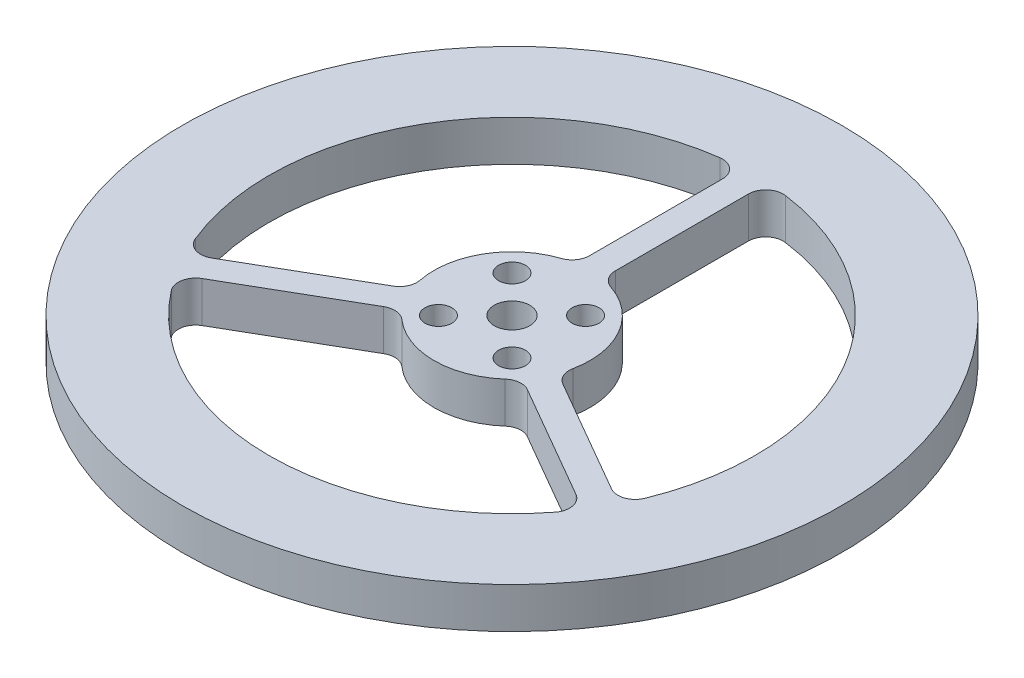
ISO-10303-21;
HEADER;
FILE_DESCRIPTION(('STEP AP214'),'2;1');
FILE_NAME('part.step','',(''),(''),'','','');
FILE_SCHEMA(('AUTOMOTIVE_DESIGN { 1 0 10303 214 1 1 1 1 }'));
ENDSEC;
DATA;
#1=APPLICATION_CONTEXT('core data for automotive mechanical design processes');
#2=APPLICATION_PROTOCOL_DEFINITION('international standard','automotive_design',2000,#1);
#3=PRODUCT_CONTEXT('',#1,'mechanical');
#4=PRODUCT('Part','Part','',(#3));
#5=PRODUCT_RELATED_PRODUCT_CATEGORY('part','',(#4));
#6=PRODUCT_DEFINITION_FORMATION('','',#4);
#7=PRODUCT_DEFINITION_CONTEXT('part definition',#1,'design');
#8=PRODUCT_DEFINITION('design','',#6,#7);
#9=PRODUCT_DEFINITION_SHAPE('','',#8);
#10=(LENGTH_UNIT() NAMED_UNIT(*) SI_UNIT(.MILLI.,.METRE.));
#11=(NAMED_UNIT(*) PLANE_ANGLE_UNIT() SI_UNIT($,.RADIAN.));
#12=(NAMED_UNIT(*) SI_UNIT($,.STERADIAN.) SOLID_ANGLE_UNIT());
#13=UNCERTAINTY_MEASURE_WITH_UNIT(LENGTH_MEASURE(1.E-05),#10,'distance_accuracy_value','');
#14=(GEOMETRIC_REPRESENTATION_CONTEXT(3) GLOBAL_UNCERTAINTY_ASSIGNED_CONTEXT((#13)) GLOBAL_UNIT_ASSIGNED_CONTEXT((#10,
#11,#12)) REPRESENTATION_CONTEXT('',''));
#15=CARTESIAN_POINT('',(0.,0.,0.));
#16=DIRECTION('',(0.,0.,1.));
#17=DIRECTION('',(1.,0.,0.));
#18=AXIS2_PLACEMENT_3D('',#15,#16,#17);
#19=CARTESIAN_POINT('',(0.,4.7,0.));
#20=DIRECTION('',(0.,-1.,0.));
#21=DIRECTION('',(0.,0.,-1.));
#22=AXIS2_PLACEMENT_3D('',#19,#20,#21);
#23=CYLINDRICAL_SURFACE('',#22,28.);
#24=CARTESIAN_POINT('',(0.,4.7,0.));
#25=DIRECTION('',(0.,1.,0.));
#26=DIRECTION('',(0.,0.,1.));
#27=AXIS2_PLACEMENT_3D('',#24,#25,#26);
#28=CIRCLE('',#27,28.);
#29=CARTESIAN_POINT('',(-22.1433823379621,4.7,17.1368205520986));
#30=VERTEX_POINT('',#29);
#31=CARTESIAN_POINT('',(22.143382337963,4.7,17.1368205520975));
#32=VERTEX_POINT('',#31);
#33=EDGE_CURVE('E450',#30,#32,#28,.T.);
#34=ORIENTED_EDGE('',*,*,#33,.T.);
#35=DIRECTION('',(0.,-1.,0.));
#36=VECTOR('',#35,1.);
#37=CARTESIAN_POINT('',(22.143382337963,4.7,17.1368205520975));
#38=LINE('',#37,#36);
#39=CARTESIAN_POINT('',(22.143382337963,0.,17.1368205520975));
#40=VERTEX_POINT('',#39);
#41=EDGE_CURVE('E251',#32,#40,#38,.T.);
#42=ORIENTED_EDGE('',*,*,#41,.T.);
#43=CARTESIAN_POINT('',(0.,0.,0.));
#44=DIRECTION('',(0.,1.,0.));
#45=DIRECTION('',(0.,0.,1.));
#46=AXIS2_PLACEMENT_3D('',#43,#44,#45);
#47=CIRCLE('',#46,28.);
#48=CARTESIAN_POINT('',(-22.1433823379621,0.,17.1368205520986));
#49=VERTEX_POINT('',#48);
#50=EDGE_CURVE('E232',#49,#40,#47,.T.);
#51=ORIENTED_EDGE('',*,*,#50,.F.);
#52=DIRECTION('',(0.,-1.,0.));
#53=VECTOR('',#52,1.);
#54=CARTESIAN_POINT('',(-22.1433823379621,4.7,17.1368205520986));
#55=LINE('',#54,#53);
#56=EDGE_CURVE('E242',#49,#30,#55,.F.);
#57=ORIENTED_EDGE('',*,*,#56,.T.);
#58=EDGE_LOOP('',(#34,#42,#51,#57));
#59=FACE_BOUND('',#58,.T.);
#60=ADVANCED_FACE('F44',(#59),#23,.F.);
#61=CARTESIAN_POINT('',(-3.76923076923076,0.,-27.7451419064362));
#62=VERTEX_POINT('',#61);
#63=CARTESIAN_POINT('',(-25.9126131071931,0.,10.6083213543391));
#64=VERTEX_POINT('',#63);
#65=EDGE_CURVE('E235',#62,#64,#47,.T.);
#66=ORIENTED_EDGE('',*,*,#65,.F.);
#67=DIRECTION('',(0.,-1.,0.));
#68=VECTOR('',#67,1.);
#69=CARTESIAN_POINT('',(-3.76923076923076,4.7,-27.7451419064362));
#70=LINE('',#69,#68);
#71=CARTESIAN_POINT('',(-3.76923076923076,4.7,-27.7451419064362));
#72=VERTEX_POINT('',#71);
#73=EDGE_CURVE('E267',#62,#72,#70,.F.);
#74=ORIENTED_EDGE('',*,*,#73,.T.);
#75=CARTESIAN_POINT('',(-25.9126131071931,4.7,10.6083213543391));
#76=VERTEX_POINT('',#75);
#77=EDGE_CURVE('E446',#72,#76,#28,.T.);
#78=ORIENTED_EDGE('',*,*,#77,.T.);
#79=DIRECTION('',(0.,-1.,0.));
#80=VECTOR('',#79,1.);
#81=CARTESIAN_POINT('',(-25.9126131071931,4.7,10.6083213543391));
#82=LINE('',#81,#80);
#83=EDGE_CURVE('E263',#76,#64,#82,.T.);
#84=ORIENTED_EDGE('',*,*,#83,.T.);
#85=EDGE_LOOP('',(#66,#74,#78,#84));
#86=FACE_BOUND('',#85,.T.);
#87=ADVANCED_FACE('F544',(#86),#23,.F.);
#88=CARTESIAN_POINT('',(0.,30.1558441227157,0.));
#89=DIRECTION('',(0.,-1.,0.));
#90=DIRECTION('',(0.,0.,-1.));
#91=AXIS2_PLACEMENT_3D('',#88,#89,#90);
#92=CYLINDRICAL_SURFACE('',#91,9.);
#93=CARTESIAN_POINT('',(0.,0.,0.));
#94=DIRECTION('',(0.,1.,0.));
#95=DIRECTION('',(0.,0.,1.));
#96=AXIS2_PLACEMENT_3D('',#93,#94,#95);
#97=CIRCLE('',#96,9.);
#98=CARTESIAN_POINT('',(-5.95734212789478,0.,6.74611553200878));
#99=VERTEX_POINT('',#98);
#100=CARTESIAN_POINT('',(5.95734212789561,0.,6.74611553200804));
#101=VERTEX_POINT('',#100);
#102=EDGE_CURVE('E410',#99,#101,#97,.T.);
#103=ORIENTED_EDGE('',*,*,#102,.T.);
#104=DIRECTION('',(0.,-1.,0.));
#105=VECTOR('',#104,1.);
#106=CARTESIAN_POINT('',(5.95734212789561,30.1558441227157,6.74611553200804));
#107=LINE('',#106,#105);
#108=CARTESIAN_POINT('',(5.95734212789561,4.7,6.74611553200804));
#109=VERTEX_POINT('',#108);
#110=EDGE_CURVE('E350',#101,#109,#107,.F.);
#111=ORIENTED_EDGE('',*,*,#110,.T.);
#112=CARTESIAN_POINT('',(0.,4.7,0.));
#113=DIRECTION('',(0.,1.,0.));
#114=DIRECTION('',(0.,0.,1.));
#115=AXIS2_PLACEMENT_3D('',#112,#113,#114);
#116=CIRCLE('',#115,9.);
#117=CARTESIAN_POINT('',(-5.95734212789478,4.7,6.74611553200878));
#118=VERTEX_POINT('',#117);
#119=EDGE_CURVE('E394',#118,#109,#116,.T.);
#120=ORIENTED_EDGE('',*,*,#119,.F.);
#121=DIRECTION('',(0.,-1.,0.));
#122=VECTOR('',#121,1.);
#123=CARTESIAN_POINT('',(-5.95734212789478,30.1558441227157,6.74611553200878));
#124=LINE('',#123,#122);
#125=EDGE_CURVE('E346',#118,#99,#124,.T.);
#126=ORIENTED_EDGE('',*,*,#125,.T.);
#127=EDGE_LOOP('',(#103,#111,#120,#126));
#128=FACE_BOUND('',#127,.T.);
#129=ADVANCED_FACE('F413',(#128),#92,.T.);
#130=CARTESIAN_POINT('',(-2.86363636363636,4.7,-8.53226738779672));
#131=VERTEX_POINT('',#130);
#132=CARTESIAN_POINT('',(-8.82097849153151,4.7,1.78615185578902));
#133=VERTEX_POINT('',#132);
#134=EDGE_CURVE('E440',#131,#133,#116,.T.);
#135=ORIENTED_EDGE('',*,*,#134,.F.);
#136=DIRECTION('',(0.,-1.,0.));
#137=VECTOR('',#136,1.);
#138=CARTESIAN_POINT('',(-2.86363636363636,30.1558441227157,-8.53226738779672));
#139=LINE('',#138,#137);
#140=CARTESIAN_POINT('',(-2.86363636363636,0.,-8.53226738779672));
#141=VERTEX_POINT('',#140);
#142=EDGE_CURVE('E328',#131,#141,#139,.T.);
#143=ORIENTED_EDGE('',*,*,#142,.T.);
#144=CARTESIAN_POINT('',(-8.82097849153151,0.,1.78615185578902));
#145=VERTEX_POINT('',#144);
#146=EDGE_CURVE('E416',#141,#145,#97,.T.);
#147=ORIENTED_EDGE('',*,*,#146,.T.);
#148=DIRECTION('',(0.,-1.,0.));
#149=VECTOR('',#148,1.);
#150=CARTESIAN_POINT('',(-8.82097849153151,30.1558441227157,1.78615185578902));
#151=LINE('',#150,#149);
#152=EDGE_CURVE('E325',#145,#133,#151,.F.);
#153=ORIENTED_EDGE('',*,*,#152,.T.);
#154=EDGE_LOOP('',(#135,#143,#147,#153));
#155=FACE_BOUND('',#154,.T.);
#156=ADVANCED_FACE('F561',(#155),#92,.T.);
#157=CARTESIAN_POINT('',(25.9126131071936,0.,10.6083213543378));
#158=VERTEX_POINT('',#157);
#159=CARTESIAN_POINT('',(3.76923076923076,0.,-27.7451419064362));
#160=VERTEX_POINT('',#159);
#161=EDGE_CURVE('E212',#158,#160,#47,.T.);
#162=ORIENTED_EDGE('',*,*,#161,.F.);
#163=DIRECTION('',(0.,-1.,0.));
#164=VECTOR('',#163,1.);
#165=CARTESIAN_POINT('',(25.9126131071936,4.7,10.6083213543378));
#166=LINE('',#165,#164);
#167=CARTESIAN_POINT('',(25.9126131071936,4.7,10.6083213543378));
#168=VERTEX_POINT('',#167);
#169=EDGE_CURVE('E227',#158,#168,#166,.F.);
#170=ORIENTED_EDGE('',*,*,#169,.T.);
#171=CARTESIAN_POINT('',(3.76923076923076,4.7,-27.7451419064362));
#172=VERTEX_POINT('',#171);
#173=EDGE_CURVE('E451',#168,#172,#28,.T.);
#174=ORIENTED_EDGE('',*,*,#173,.T.);
#175=DIRECTION('',(0.,-1.,0.));
#176=VECTOR('',#175,1.);
#177=CARTESIAN_POINT('',(3.76923076923076,4.7,-27.7451419064362));
#178=LINE('',#177,#176);
#179=EDGE_CURVE('E230',#172,#160,#178,.T.);
#180=ORIENTED_EDGE('',*,*,#179,.T.);
#181=EDGE_LOOP('',(#162,#170,#174,#180));
#182=FACE_BOUND('',#181,.T.);
#183=ADVANCED_FACE('F225',(#182),#23,.F.);
#184=CARTESIAN_POINT('',(8.82097849153173,0.,1.78615185578793));
#185=VERTEX_POINT('',#184);
#186=CARTESIAN_POINT('',(2.86363636363636,0.,-8.53226738779672));
#187=VERTEX_POINT('',#186);
#188=EDGE_CURVE('E417',#185,#187,#97,.T.);
#189=ORIENTED_EDGE('',*,*,#188,.T.);
#190=DIRECTION('',(0.,-1.,0.));
#191=VECTOR('',#190,1.);
#192=CARTESIAN_POINT('',(2.86363636363636,30.1558441227157,-8.53226738779672));
#193=LINE('',#192,#191);
#194=CARTESIAN_POINT('',(2.86363636363636,4.7,-8.53226738779672));
#195=VERTEX_POINT('',#194);
#196=EDGE_CURVE('E322',#187,#195,#193,.F.);
#197=ORIENTED_EDGE('',*,*,#196,.T.);
#198=CARTESIAN_POINT('',(8.82097849153173,4.7,1.78615185578793));
#199=VERTEX_POINT('',#198);
#200=EDGE_CURVE('E422',#199,#195,#116,.T.);
#201=ORIENTED_EDGE('',*,*,#200,.F.);
#202=DIRECTION('',(0.,-1.,0.));
#203=VECTOR('',#202,1.);
#204=CARTESIAN_POINT('',(8.82097849153173,30.1558441227157,1.78615185578793));
#205=LINE('',#204,#203);
#206=EDGE_CURVE('E318',#199,#185,#205,.T.);
#207=ORIENTED_EDGE('',*,*,#206,.T.);
#208=EDGE_LOOP('',(#189,#197,#201,#207));
#209=FACE_BOUND('',#208,.T.);
#210=ADVANCED_FACE('F618',(#209),#92,.T.);
#211=CARTESIAN_POINT('',(0.,4.7,0.));
#212=DIRECTION('',(0.,1.,0.));
#213=DIRECTION('',(0.,0.,1.));
#214=AXIS2_PLACEMENT_3D('',#211,#212,#213);
#215=PLANE('',#214);
#216=ORIENTED_EDGE('',*,*,#33,.F.);
#217=CARTESIAN_POINT('',(-20.5617121709648,4.7,15.9127619412344));
#218=DIRECTION('',(0.,1.,0.));
#219=DIRECTION('',(0.,0.,1.));
#220=AXIS2_PLACEMENT_3D('',#217,#218,#219);
#221=CIRCLE('',#220,2.);
#222=CARTESIAN_POINT('',(-21.5617121709648,4.7,14.1807111336655));
#223=VERTEX_POINT('',#222);
#224=EDGE_CURVE('E308',#30,#223,#221,.F.);
#225=ORIENTED_EDGE('',*,*,#224,.T.);
#226=DIRECTION('',(0.866025403784439,0.,-0.5));
#227=VECTOR('',#226,1.);
#228=CARTESIAN_POINT('',(-24.3647367097482,4.7,15.7990381056772));
#229=LINE('',#228,#227);
#230=CARTESIAN_POINT('',(-8.28119593409362,4.7,6.51320150933074));
#231=VERTEX_POINT('',#230);
#232=EDGE_CURVE('E518',#223,#231,#229,.T.);
#233=ORIENTED_EDGE('',*,*,#232,.T.);
#234=CARTESIAN_POINT('',(-7.28119593409362,4.7,8.24525231689961));
#235=DIRECTION('',(0.,1.,0.));
#236=DIRECTION('',(0.,0.,1.));
#237=AXIS2_PLACEMENT_3D('',#234,#235,#236);
#238=CIRCLE('',#237,2.);
#239=EDGE_CURVE('E11',#231,#118,#238,.F.);
#240=ORIENTED_EDGE('',*,*,#239,.T.);
#241=ORIENTED_EDGE('',*,*,#119,.T.);
#242=CARTESIAN_POINT('',(7.28119593409464,4.7,8.24525231689872));
#243=DIRECTION('',(0.,1.,0.));
#244=DIRECTION('',(0.,0.,1.));
#245=AXIS2_PLACEMENT_3D('',#242,#243,#244);
#246=CIRCLE('',#245,2.);
#247=CARTESIAN_POINT('',(8.28119593409464,4.7,6.51320150932984));
#248=VERTEX_POINT('',#247);
#249=EDGE_CURVE('E382',#109,#248,#246,.F.);
#250=ORIENTED_EDGE('',*,*,#249,.T.);
#251=DIRECTION('',(0.866025403784439,0.,0.499999999999999));
#252=VECTOR('',#251,1.);
#253=CARTESIAN_POINT('',(24.3647367097495,4.7,15.7990381056765));
#254=LINE('',#253,#252);
#255=CARTESIAN_POINT('',(21.5617121709656,4.7,14.1807111336645));
#256=VERTEX_POINT('',#255);
#257=EDGE_CURVE('E392',#248,#256,#254,.T.);
#258=ORIENTED_EDGE('',*,*,#257,.T.);
#259=CARTESIAN_POINT('',(20.5617121709656,4.7,15.9127619412334));
#260=DIRECTION('',(0.,1.,0.));
#261=DIRECTION('',(0.,0.,1.));
#262=AXIS2_PLACEMENT_3D('',#259,#260,#261);
#263=CIRCLE('',#262,2.);
#264=EDGE_CURVE('E286',#256,#32,#263,.F.);
#265=ORIENTED_EDGE('',*,*,#264,.T.);
#266=EDGE_LOOP('',(#216,#225,#233,#240,#241,#250,#258,#265));
#267=FACE_BOUND('',#266,.T.);
#268=ORIENTED_EDGE('',*,*,#134,.T.);
#269=CARTESIAN_POINT('',(-10.7811959340941,4.7,2.1830744904088));
#270=DIRECTION('',(0.,1.,0.));
#271=DIRECTION('',(0.,0.,1.));
#272=AXIS2_PLACEMENT_3D('',#269,#270,#271);
#273=CIRCLE('',#272,2.);
#274=CARTESIAN_POINT('',(-9.78119593409406,4.7,3.91512529797768));
#275=VERTEX_POINT('',#274);
#276=EDGE_CURVE('E370',#133,#275,#273,.F.);
#277=ORIENTED_EDGE('',*,*,#276,.T.);
#278=DIRECTION('',(-0.866025403784438,0.,0.500000000000001));
#279=VECTOR('',#278,1.);
#280=CARTESIAN_POINT('',(-25.8647367097482,4.7,13.2009618943239));
#281=LINE('',#280,#279);
#282=CARTESIAN_POINT('',(-23.061712170965,4.7,11.5826349223123));
#283=VERTEX_POINT('',#282);
#284=EDGE_CURVE('E515',#275,#283,#281,.T.);
#285=ORIENTED_EDGE('',*,*,#284,.T.);
#286=CARTESIAN_POINT('',(-24.061712170965,4.7,9.85058411474344));
#287=DIRECTION('',(0.,1.,0.));
#288=DIRECTION('',(0.,0.,1.));
#289=AXIS2_PLACEMENT_3D('',#286,#287,#288);
#290=CIRCLE('',#289,2.);
#291=EDGE_CURVE('E305',#283,#76,#290,.F.);
#292=ORIENTED_EDGE('',*,*,#291,.T.);
#293=ORIENTED_EDGE('',*,*,#77,.F.);
#294=CARTESIAN_POINT('',(-3.49999999999999,4.7,-25.7633460559765));
#295=DIRECTION('',(0.,1.,0.));
#296=DIRECTION('',(0.,0.,1.));
#297=AXIS2_PLACEMENT_3D('',#294,#295,#296);
#298=CIRCLE('',#297,2.);
#299=CARTESIAN_POINT('',(-1.49999999999999,4.7,-25.7633460559765));
#300=VERTEX_POINT('',#299);
#301=EDGE_CURVE('E295',#72,#300,#298,.F.);
#302=ORIENTED_EDGE('',*,*,#301,.T.);
#303=DIRECTION('',(0.,0.,1.));
#304=VECTOR('',#303,1.);
#305=CARTESIAN_POINT('',(-1.49999999999999,4.7,-29.));
#306=LINE('',#305,#304);
#307=CARTESIAN_POINT('',(-1.5,4.7,-10.4283268073071));
#308=VERTEX_POINT('',#307);
#309=EDGE_CURVE('E233',#300,#308,#306,.T.);
#310=ORIENTED_EDGE('',*,*,#309,.T.);
#311=CARTESIAN_POINT('',(-3.5,4.7,-10.4283268073071));
#312=DIRECTION('',(0.,1.,0.));
#313=DIRECTION('',(0.,0.,1.));
#314=AXIS2_PLACEMENT_3D('',#311,#312,#313);
#315=CIRCLE('',#314,2.);
#316=EDGE_CURVE('E364',#308,#131,#315,.F.);
#317=ORIENTED_EDGE('',*,*,#316,.T.);
#318=EDGE_LOOP('',(#268,#277,#285,#292,#293,#302,#310,#317));
#319=FACE_BOUND('',#318,.T.);
#320=ORIENTED_EDGE('',*,*,#173,.F.);
#321=CARTESIAN_POINT('',(24.0617121709655,4.7,9.85058411474223));
#322=DIRECTION('',(0.,1.,0.));
#323=DIRECTION('',(0.,0.,1.));
#324=AXIS2_PLACEMENT_3D('',#321,#322,#323);
#325=CIRCLE('',#324,2.);
#326=CARTESIAN_POINT('',(23.0617121709655,4.7,11.5826349223111));
#327=VERTEX_POINT('',#326);
#328=EDGE_CURVE('E220',#168,#327,#325,.F.);
#329=ORIENTED_EDGE('',*,*,#328,.T.);
#330=DIRECTION('',(-0.866025403784439,0.,-0.5));
#331=VECTOR('',#330,1.);
#332=CARTESIAN_POINT('',(25.8647367097495,4.7,13.2009618943232));
#333=LINE('',#332,#331);
#334=CARTESIAN_POINT('',(9.78119593409433,4.7,3.91512529797635));
#335=VERTEX_POINT('',#334);
#336=EDGE_CURVE('E405',#327,#335,#333,.T.);
#337=ORIENTED_EDGE('',*,*,#336,.T.);
#338=CARTESIAN_POINT('',(10.7811959340943,4.7,2.18307449040747));
#339=DIRECTION('',(0.,1.,0.));
#340=DIRECTION('',(0.,0.,1.));
#341=AXIS2_PLACEMENT_3D('',#338,#339,#340);
#342=CIRCLE('',#341,2.);
#343=EDGE_CURVE('E376',#335,#199,#342,.F.);
#344=ORIENTED_EDGE('',*,*,#343,.T.);
#345=ORIENTED_EDGE('',*,*,#200,.T.);
#346=CARTESIAN_POINT('',(3.5,4.7,-10.4283268073071));
#347=DIRECTION('',(0.,1.,0.));
#348=DIRECTION('',(0.,0.,1.));
#349=AXIS2_PLACEMENT_3D('',#346,#347,#348);
#350=CIRCLE('',#349,2.);
#351=CARTESIAN_POINT('',(1.5,4.7,-10.4283268073071));
#352=VERTEX_POINT('',#351);
#353=EDGE_CURVE('E358',#195,#352,#350,.F.);
#354=ORIENTED_EDGE('',*,*,#353,.T.);
#355=DIRECTION('',(0.,0.,-1.));
#356=VECTOR('',#355,1.);
#357=CARTESIAN_POINT('',(1.49999999999999,4.7,-29.));
#358=LINE('',#357,#356);
#359=CARTESIAN_POINT('',(1.49999999999999,4.7,-25.7633460559765));
#360=VERTEX_POINT('',#359);
#361=EDGE_CURVE('E435',#352,#360,#358,.T.);
#362=ORIENTED_EDGE('',*,*,#361,.T.);
#363=CARTESIAN_POINT('',(3.49999999999999,4.7,-25.7633460559765));
#364=DIRECTION('',(0.,1.,0.));
#365=DIRECTION('',(0.,0.,1.));
#366=AXIS2_PLACEMENT_3D('',#363,#364,#365);
#367=CIRCLE('',#366,2.);
#368=EDGE_CURVE('E292',#360,#172,#367,.F.);
#369=ORIENTED_EDGE('',*,*,#368,.T.);
#370=EDGE_LOOP('',(#320,#329,#337,#344,#345,#354,#362,#369));
#371=FACE_BOUND('',#370,.T.);
#372=CARTESIAN_POINT('',(0.,4.7,0.));
#373=DIRECTION('',(0.,1.,0.));
#374=DIRECTION('',(0.,0.,1.));
#375=AXIS2_PLACEMENT_3D('',#372,#373,#374);
#376=CIRCLE('',#375,38.);
#377=CARTESIAN_POINT('',(0.,4.7,38.));
#378=VERTEX_POINT('',#377);
#379=EDGE_CURVE('E244',#378,#378,#376,.T.);
#380=ORIENTED_EDGE('',*,*,#379,.T.);
#381=EDGE_LOOP('',(#380));
#382=FACE_BOUND('',#381,.T.);
#383=CARTESIAN_POINT('',(0.,4.7,0.));
#384=DIRECTION('',(0.,1.,0.));
#385=DIRECTION('',(0.,0.,1.));
#386=AXIS2_PLACEMENT_3D('',#383,#384,#385);
#387=CIRCLE('',#386,2.05);
#388=CARTESIAN_POINT('',(0.,4.7,2.05));
#389=VERTEX_POINT('',#388);
#390=EDGE_CURVE('E485',#389,#389,#387,.T.);
#391=ORIENTED_EDGE('',*,*,#390,.F.);
#392=EDGE_LOOP('',(#391));
#393=FACE_BOUND('',#392,.T.);
#394=CARTESIAN_POINT('',(-4.24264068711929,4.7,-4.24264068711928));
#395=DIRECTION('',(0.,1.,0.));
#396=DIRECTION('',(0.,0.,1.));
#397=AXIS2_PLACEMENT_3D('',#394,#395,#396);
#398=CIRCLE('',#397,1.55);
#399=CARTESIAN_POINT('',(-4.24264068711929,4.7,-2.69264068711928));
#400=VERTEX_POINT('',#399);
#401=EDGE_CURVE('E491',#400,#400,#398,.T.);
#402=ORIENTED_EDGE('',*,*,#401,.F.);
#403=EDGE_LOOP('',(#402));
#404=FACE_BOUND('',#403,.T.);
#405=CARTESIAN_POINT('',(-4.24264068711928,4.7,4.24264068711929));
#406=DIRECTION('',(0.,1.,0.));
#407=DIRECTION('',(0.,0.,1.));
#408=AXIS2_PLACEMENT_3D('',#405,#406,#407);
#409=CIRCLE('',#408,1.55);
#410=CARTESIAN_POINT('',(-4.24264068711928,4.7,5.79264068711929));
#411=VERTEX_POINT('',#410);
#412=EDGE_CURVE('E503',#411,#411,#409,.T.);
#413=ORIENTED_EDGE('',*,*,#412,.F.);
#414=EDGE_LOOP('',(#413));
#415=FACE_BOUND('',#414,.T.);
#416=CARTESIAN_POINT('',(4.24264068711929,4.7,4.24264068711927));
#417=DIRECTION('',(0.,1.,0.));
#418=DIRECTION('',(0.,0.,1.));
#419=AXIS2_PLACEMENT_3D('',#416,#417,#418);
#420=CIRCLE('',#419,1.55);
#421=CARTESIAN_POINT('',(4.24264068711929,4.7,5.79264068711927));
#422=VERTEX_POINT('',#421);
#423=EDGE_CURVE('E431',#422,#422,#420,.T.);
#424=ORIENTED_EDGE('',*,*,#423,.F.);
#425=EDGE_LOOP('',(#424));
#426=FACE_BOUND('',#425,.T.);
#427=CARTESIAN_POINT('',(4.24264068711927,4.7,-4.2426406871193));
#428=DIRECTION('',(0.,1.,0.));
#429=DIRECTION('',(0.,0.,1.));
#430=AXIS2_PLACEMENT_3D('',#427,#428,#429);
#431=CIRCLE('',#430,1.55);
#432=CARTESIAN_POINT('',(4.24264068711927,4.7,-2.6926406871193));
#433=VERTEX_POINT('',#432);
#434=EDGE_CURVE('E404',#433,#433,#431,.T.);
#435=ORIENTED_EDGE('',*,*,#434,.F.);
#436=EDGE_LOOP('',(#435));
#437=FACE_BOUND('',#436,.T.);
#438=ADVANCED_FACE('F390',(#267,#319,#371,#382,#393,#404,#415,#426,#437),#215,.T.);
#439=CARTESIAN_POINT('',(0.,0.,0.));
#440=DIRECTION('',(0.,1.,0.));
#441=DIRECTION('',(0.,0.,1.));
#442=AXIS2_PLACEMENT_3D('',#439,#440,#441);
#443=PLANE('',#442);
#444=DIRECTION('',(0.866025403784439,0.,-0.5));
#445=VECTOR('',#444,1.);
#446=CARTESIAN_POINT('',(-24.3647367097482,0.,15.7990381056772));
#447=LINE('',#446,#445);
#448=CARTESIAN_POINT('',(-21.5617121709648,0.,14.1807111336655));
#449=VERTEX_POINT('',#448);
#450=CARTESIAN_POINT('',(-8.28119593409362,0.,6.51320150933074));
#451=VERTEX_POINT('',#450);
#452=EDGE_CURVE('E524',#449,#451,#447,.T.);
#453=ORIENTED_EDGE('',*,*,#452,.F.);
#454=CARTESIAN_POINT('',(-20.5617121709648,0.,15.9127619412344));
#455=DIRECTION('',(0.,1.,0.));
#456=DIRECTION('',(0.,0.,1.));
#457=AXIS2_PLACEMENT_3D('',#454,#455,#456);
#458=CIRCLE('',#457,2.);
#459=EDGE_CURVE('E311',#449,#49,#458,.T.);
#460=ORIENTED_EDGE('',*,*,#459,.T.);
#461=ORIENTED_EDGE('',*,*,#50,.T.);
#462=CARTESIAN_POINT('',(20.5617121709656,0.,15.9127619412334));
#463=DIRECTION('',(0.,1.,0.));
#464=DIRECTION('',(0.,0.,1.));
#465=AXIS2_PLACEMENT_3D('',#462,#463,#464);
#466=CIRCLE('',#465,2.);
#467=CARTESIAN_POINT('',(21.5617121709656,0.,14.1807111336645));
#468=VERTEX_POINT('',#467);
#469=EDGE_CURVE('E219',#40,#468,#466,.T.);
#470=ORIENTED_EDGE('',*,*,#469,.T.);
#471=DIRECTION('',(0.866025403784439,0.,0.499999999999999));
#472=VECTOR('',#471,1.);
#473=CARTESIAN_POINT('',(24.3647367097495,0.,15.7990381056765));
#474=LINE('',#473,#472);
#475=CARTESIAN_POINT('',(8.28119593409464,0.,6.51320150932984));
#476=VERTEX_POINT('',#475);
#477=EDGE_CURVE('E411',#476,#468,#474,.T.);
#478=ORIENTED_EDGE('',*,*,#477,.F.);
#479=CARTESIAN_POINT('',(7.28119593409464,0.,8.24525231689872));
#480=DIRECTION('',(0.,1.,0.));
#481=DIRECTION('',(0.,0.,1.));
#482=AXIS2_PLACEMENT_3D('',#479,#480,#481);
#483=CIRCLE('',#482,2.);
#484=EDGE_CURVE('E379',#476,#101,#483,.T.);
#485=ORIENTED_EDGE('',*,*,#484,.T.);
#486=ORIENTED_EDGE('',*,*,#102,.F.);
#487=CARTESIAN_POINT('',(-7.28119593409362,0.,8.24525231689961));
#488=DIRECTION('',(0.,1.,0.));
#489=DIRECTION('',(0.,0.,1.));
#490=AXIS2_PLACEMENT_3D('',#487,#488,#489);
#491=CIRCLE('',#490,2.);
#492=EDGE_CURVE('E53',#99,#451,#491,.T.);
#493=ORIENTED_EDGE('',*,*,#492,.T.);
#494=EDGE_LOOP('',(#453,#460,#461,#470,#478,#485,#486,#493));
#495=FACE_BOUND('',#494,.T.);
#496=DIRECTION('',(0.,0.,1.));
#497=VECTOR('',#496,1.);
#498=CARTESIAN_POINT('',(-1.49999999999999,0.,-29.));
#499=LINE('',#498,#497);
#500=CARTESIAN_POINT('',(-1.49999999999999,0.,-25.7633460559765));
#501=VERTEX_POINT('',#500);
#502=CARTESIAN_POINT('',(-1.5,0.,-10.4283268073071));
#503=VERTEX_POINT('',#502);
#504=EDGE_CURVE('E436',#501,#503,#499,.T.);
#505=ORIENTED_EDGE('',*,*,#504,.F.);
#506=CARTESIAN_POINT('',(-3.49999999999999,0.,-25.7633460559765));
#507=DIRECTION('',(0.,1.,0.));
#508=DIRECTION('',(0.,0.,1.));
#509=AXIS2_PLACEMENT_3D('',#506,#507,#508);
#510=CIRCLE('',#509,2.);
#511=EDGE_CURVE('E298',#501,#62,#510,.T.);
#512=ORIENTED_EDGE('',*,*,#511,.T.);
#513=ORIENTED_EDGE('',*,*,#65,.T.);
#514=CARTESIAN_POINT('',(-24.061712170965,0.,9.85058411474344));
#515=DIRECTION('',(0.,1.,0.));
#516=DIRECTION('',(0.,0.,1.));
#517=AXIS2_PLACEMENT_3D('',#514,#515,#516);
#518=CIRCLE('',#517,2.);
#519=CARTESIAN_POINT('',(-23.061712170965,0.,11.5826349223123));
#520=VERTEX_POINT('',#519);
#521=EDGE_CURVE('E301',#64,#520,#518,.T.);
#522=ORIENTED_EDGE('',*,*,#521,.T.);
#523=DIRECTION('',(-0.866025403784438,0.,0.500000000000001));
#524=VECTOR('',#523,1.);
#525=CARTESIAN_POINT('',(-25.8647367097482,0.,13.2009618943239));
#526=LINE('',#525,#524);
#527=CARTESIAN_POINT('',(-9.78119593409406,0.,3.91512529797768));
#528=VERTEX_POINT('',#527);
#529=EDGE_CURVE('E521',#528,#520,#526,.T.);
#530=ORIENTED_EDGE('',*,*,#529,.F.);
#531=CARTESIAN_POINT('',(-10.7811959340941,0.,2.1830744904088));
#532=DIRECTION('',(0.,1.,0.));
#533=DIRECTION('',(0.,0.,1.));
#534=AXIS2_PLACEMENT_3D('',#531,#532,#533);
#535=CIRCLE('',#534,2.);
#536=EDGE_CURVE('E367',#528,#145,#535,.T.);
#537=ORIENTED_EDGE('',*,*,#536,.T.);
#538=ORIENTED_EDGE('',*,*,#146,.F.);
#539=CARTESIAN_POINT('',(-3.5,0.,-10.4283268073071));
#540=DIRECTION('',(0.,1.,0.));
#541=DIRECTION('',(0.,0.,1.));
#542=AXIS2_PLACEMENT_3D('',#539,#540,#541);
#543=CIRCLE('',#542,2.);
#544=EDGE_CURVE('E361',#141,#503,#543,.T.);
#545=ORIENTED_EDGE('',*,*,#544,.T.);
#546=EDGE_LOOP('',(#505,#512,#513,#522,#530,#537,#538,#545));
#547=FACE_BOUND('',#546,.T.);
#548=DIRECTION('',(-0.866025403784438,0.,-0.5));
#549=VECTOR('',#548,1.);
#550=CARTESIAN_POINT('',(25.8647367097495,0.,13.2009618943232));
#551=LINE('',#550,#549);
#552=CARTESIAN_POINT('',(23.0617121709655,0.,11.5826349223111));
#553=VERTEX_POINT('',#552);
#554=CARTESIAN_POINT('',(9.78119593409433,0.,3.91512529797635));
#555=VERTEX_POINT('',#554);
#556=EDGE_CURVE('E214',#553,#555,#551,.T.);
#557=ORIENTED_EDGE('',*,*,#556,.F.);
#558=CARTESIAN_POINT('',(24.0617121709655,0.,9.85058411474223));
#559=DIRECTION('',(0.,1.,0.));
#560=DIRECTION('',(0.,0.,1.));
#561=AXIS2_PLACEMENT_3D('',#558,#559,#560);
#562=CIRCLE('',#561,2.);
#563=EDGE_CURVE('E207',#553,#158,#562,.T.);
#564=ORIENTED_EDGE('',*,*,#563,.T.);
#565=ORIENTED_EDGE('',*,*,#161,.T.);
#566=CARTESIAN_POINT('',(3.49999999999999,0.,-25.7633460559765));
#567=DIRECTION('',(0.,1.,0.));
#568=DIRECTION('',(0.,0.,1.));
#569=AXIS2_PLACEMENT_3D('',#566,#567,#568);
#570=CIRCLE('',#569,2.);
#571=CARTESIAN_POINT('',(1.49999999999999,0.,-25.7633460559765));
#572=VERTEX_POINT('',#571);
#573=EDGE_CURVE('E289',#160,#572,#570,.T.);
#574=ORIENTED_EDGE('',*,*,#573,.T.);
#575=DIRECTION('',(0.,0.,-1.));
#576=VECTOR('',#575,1.);
#577=CARTESIAN_POINT('',(1.49999999999999,0.,-29.));
#578=LINE('',#577,#576);
#579=CARTESIAN_POINT('',(1.5,0.,-10.4283268073071));
#580=VERTEX_POINT('',#579);
#581=EDGE_CURVE('E432',#580,#572,#578,.T.);
#582=ORIENTED_EDGE('',*,*,#581,.F.);
#583=CARTESIAN_POINT('',(3.5,0.,-10.4283268073071));
#584=DIRECTION('',(0.,1.,0.));
#585=DIRECTION('',(0.,0.,1.));
#586=AXIS2_PLACEMENT_3D('',#583,#584,#585);
#587=CIRCLE('',#586,2.);
#588=EDGE_CURVE('E355',#580,#187,#587,.T.);
#589=ORIENTED_EDGE('',*,*,#588,.T.);
#590=ORIENTED_EDGE('',*,*,#188,.F.);
#591=CARTESIAN_POINT('',(10.7811959340943,0.,2.18307449040747));
#592=DIRECTION('',(0.,1.,0.));
#593=DIRECTION('',(0.,0.,1.));
#594=AXIS2_PLACEMENT_3D('',#591,#592,#593);
#595=CIRCLE('',#594,2.);
#596=EDGE_CURVE('E373',#185,#555,#595,.T.);
#597=ORIENTED_EDGE('',*,*,#596,.T.);
#598=EDGE_LOOP('',(#557,#564,#565,#574,#582,#589,#590,#597));
#599=FACE_BOUND('',#598,.T.);
#600=CARTESIAN_POINT('',(0.,0.,0.));
#601=DIRECTION('',(0.,1.,0.));
#602=DIRECTION('',(0.,0.,1.));
#603=AXIS2_PLACEMENT_3D('',#600,#601,#602);
#604=CIRCLE('',#603,38.);
#605=CARTESIAN_POINT('',(0.,0.,38.));
#606=VERTEX_POINT('',#605);
#607=EDGE_CURVE('E449',#606,#606,#604,.T.);
#608=ORIENTED_EDGE('',*,*,#607,.F.);
#609=EDGE_LOOP('',(#608));
#610=FACE_BOUND('',#609,.T.);
#611=CARTESIAN_POINT('',(0.,0.,0.));
#612=DIRECTION('',(0.,1.,0.));
#613=DIRECTION('',(0.,0.,1.));
#614=AXIS2_PLACEMENT_3D('',#611,#612,#613);
#615=CIRCLE('',#614,2.05);
#616=CARTESIAN_POINT('',(0.,0.,2.05));
#617=VERTEX_POINT('',#616);
#618=EDGE_CURVE('E424',#617,#617,#615,.T.);
#619=ORIENTED_EDGE('',*,*,#618,.T.);
#620=EDGE_LOOP('',(#619));
#621=FACE_BOUND('',#620,.T.);
#622=CARTESIAN_POINT('',(-4.24264068711929,0.,-4.24264068711928));
#623=DIRECTION('',(0.,1.,0.));
#624=DIRECTION('',(0.,0.,1.));
#625=AXIS2_PLACEMENT_3D('',#622,#623,#624);
#626=CIRCLE('',#625,1.55);
#627=CARTESIAN_POINT('',(-4.24264068711929,0.,-2.69264068711928));
#628=VERTEX_POINT('',#627);
#629=EDGE_CURVE('E471',#628,#628,#626,.T.);
#630=ORIENTED_EDGE('',*,*,#629,.T.);
#631=EDGE_LOOP('',(#630));
#632=FACE_BOUND('',#631,.T.);
#633=CARTESIAN_POINT('',(-4.24264068711928,0.,4.24264068711929));
#634=DIRECTION('',(0.,1.,0.));
#635=DIRECTION('',(0.,0.,1.));
#636=AXIS2_PLACEMENT_3D('',#633,#634,#635);
#637=CIRCLE('',#636,1.55);
#638=CARTESIAN_POINT('',(-4.24264068711928,0.,5.79264068711929));
#639=VERTEX_POINT('',#638);
#640=EDGE_CURVE('E475',#639,#639,#637,.T.);
#641=ORIENTED_EDGE('',*,*,#640,.T.);
#642=EDGE_LOOP('',(#641));
#643=FACE_BOUND('',#642,.T.);
#644=CARTESIAN_POINT('',(4.24264068711929,0.,4.24264068711927));
#645=DIRECTION('',(0.,1.,0.));
#646=DIRECTION('',(0.,0.,1.));
#647=AXIS2_PLACEMENT_3D('',#644,#645,#646);
#648=CIRCLE('',#647,1.55);
#649=CARTESIAN_POINT('',(4.24264068711929,0.,5.79264068711927));
#650=VERTEX_POINT('',#649);
#651=EDGE_CURVE('E479',#650,#650,#648,.T.);
#652=ORIENTED_EDGE('',*,*,#651,.T.);
#653=EDGE_LOOP('',(#652));
#654=FACE_BOUND('',#653,.T.);
#655=CARTESIAN_POINT('',(4.24264068711927,0.,-4.2426406871193));
#656=DIRECTION('',(0.,1.,0.));
#657=DIRECTION('',(0.,0.,1.));
#658=AXIS2_PLACEMENT_3D('',#655,#656,#657);
#659=CIRCLE('',#658,1.55);
#660=CARTESIAN_POINT('',(4.24264068711927,0.,-2.6926406871193));
#661=VERTEX_POINT('',#660);
#662=EDGE_CURVE('E482',#661,#661,#659,.T.);
#663=ORIENTED_EDGE('',*,*,#662,.T.);
#664=EDGE_LOOP('',(#663));
#665=FACE_BOUND('',#664,.T.);
#666=ADVANCED_FACE('F209',(#495,#547,#599,#610,#621,#632,#643,#654,#665),#443,.F.);
#667=CARTESIAN_POINT('',(0.,4.7,0.));
#668=DIRECTION('',(0.,-1.,0.));
#669=DIRECTION('',(0.,0.,-1.));
#670=AXIS2_PLACEMENT_3D('',#667,#668,#669);
#671=CYLINDRICAL_SURFACE('',#670,38.);
#672=ORIENTED_EDGE('',*,*,#379,.F.);
#673=EDGE_LOOP('',(#672));
#674=FACE_BOUND('',#673,.T.);
#675=ORIENTED_EDGE('',*,*,#607,.T.);
#676=EDGE_LOOP('',(#675));
#677=FACE_BOUND('',#676,.T.);
#678=ADVANCED_FACE('F461',(#674,#677),#671,.T.);
#679=CARTESIAN_POINT('',(-1.49999999999999,27.4734099484905,-29.));
#680=DIRECTION('',(1.,0.,0.));
#681=DIRECTION('',(0.,0.,-1.));
#682=AXIS2_PLACEMENT_3D('',#679,#680,#681);
#683=PLANE('',#682);
#684=ORIENTED_EDGE('',*,*,#504,.T.);
#685=DIRECTION('',(0.,1.,0.));
#686=VECTOR('',#685,1.);
#687=CARTESIAN_POINT('',(-1.5,4.7,-10.4283268073071));
#688=LINE('',#687,#686);
#689=EDGE_CURVE('E332',#503,#308,#688,.T.);
#690=ORIENTED_EDGE('',*,*,#689,.T.);
#691=ORIENTED_EDGE('',*,*,#309,.F.);
#692=DIRECTION('',(0.,-1.,0.));
#693=VECTOR('',#692,1.);
#694=CARTESIAN_POINT('',(-1.49999999999999,27.4734099484905,-25.7633460559765));
#695=LINE('',#694,#693);
#696=EDGE_CURVE('E271',#300,#501,#695,.T.);
#697=ORIENTED_EDGE('',*,*,#696,.T.);
#698=EDGE_LOOP('',(#684,#690,#691,#697));
#699=FACE_BOUND('',#698,.T.);
#700=ADVANCED_FACE('F553',(#699),#683,.F.);
#701=CARTESIAN_POINT('',(1.49999999999999,27.4734099484905,-29.));
#702=DIRECTION('',(-1.,0.,0.));
#703=DIRECTION('',(0.,0.,1.));
#704=AXIS2_PLACEMENT_3D('',#701,#702,#703);
#705=PLANE('',#704);
#706=ORIENTED_EDGE('',*,*,#361,.F.);
#707=DIRECTION('',(0.,1.,0.));
#708=VECTOR('',#707,1.);
#709=CARTESIAN_POINT('',(1.5,0.,-10.4283268073071));
#710=LINE('',#709,#708);
#711=EDGE_CURVE('E314',#352,#580,#710,.F.);
#712=ORIENTED_EDGE('',*,*,#711,.T.);
#713=ORIENTED_EDGE('',*,*,#581,.T.);
#714=DIRECTION('',(0.,-1.,0.));
#715=VECTOR('',#714,1.);
#716=CARTESIAN_POINT('',(1.49999999999999,27.4734099484905,-25.7633460559765));
#717=LINE('',#716,#715);
#718=EDGE_CURVE('E259',#572,#360,#717,.F.);
#719=ORIENTED_EDGE('',*,*,#718,.T.);
#720=EDGE_LOOP('',(#706,#712,#713,#719));
#721=FACE_BOUND('',#720,.T.);
#722=ADVANCED_FACE('F580',(#721),#705,.F.);
#723=CARTESIAN_POINT('',(4.24264068711929,30.1558441227157,4.24264068711927));
#724=DIRECTION('',(0.,-1.,0.));
#725=DIRECTION('',(0.,0.,-1.));
#726=AXIS2_PLACEMENT_3D('',#723,#724,#725);
#727=CYLINDRICAL_SURFACE('',#726,1.55);
#728=ORIENTED_EDGE('',*,*,#651,.F.);
#729=EDGE_LOOP('',(#728));
#730=FACE_BOUND('',#729,.T.);
#731=ORIENTED_EDGE('',*,*,#423,.T.);
#732=EDGE_LOOP('',(#731));
#733=FACE_BOUND('',#732,.T.);
#734=ADVANCED_FACE('F633',(#730,#733),#727,.F.);
#735=CARTESIAN_POINT('',(-4.24264068711928,30.1558441227157,4.24264068711929));
#736=DIRECTION('',(0.,-1.,0.));
#737=DIRECTION('',(0.,0.,-1.));
#738=AXIS2_PLACEMENT_3D('',#735,#736,#737);
#739=CYLINDRICAL_SURFACE('',#738,1.55);
#740=ORIENTED_EDGE('',*,*,#640,.F.);
#741=EDGE_LOOP('',(#740));
#742=FACE_BOUND('',#741,.T.);
#743=ORIENTED_EDGE('',*,*,#412,.T.);
#744=EDGE_LOOP('',(#743));
#745=FACE_BOUND('',#744,.T.);
#746=ADVANCED_FACE('F683',(#742,#745),#739,.F.);
#747=CARTESIAN_POINT('',(-4.24264068711929,30.1558441227157,-4.24264068711928));
#748=DIRECTION('',(0.,-1.,0.));
#749=DIRECTION('',(0.,0.,-1.));
#750=AXIS2_PLACEMENT_3D('',#747,#748,#749);
#751=CYLINDRICAL_SURFACE('',#750,1.55);
#752=ORIENTED_EDGE('',*,*,#629,.F.);
#753=EDGE_LOOP('',(#752));
#754=FACE_BOUND('',#753,.T.);
#755=ORIENTED_EDGE('',*,*,#401,.T.);
#756=EDGE_LOOP('',(#755));
#757=FACE_BOUND('',#756,.T.);
#758=ADVANCED_FACE('F686',(#754,#757),#751,.F.);
#759=CARTESIAN_POINT('',(0.,30.1558441227157,0.));
#760=DIRECTION('',(0.,-1.,0.));
#761=DIRECTION('',(0.,0.,-1.));
#762=AXIS2_PLACEMENT_3D('',#759,#760,#761);
#763=CYLINDRICAL_SURFACE('',#762,2.05);
#764=ORIENTED_EDGE('',*,*,#618,.F.);
#765=EDGE_LOOP('',(#764));
#766=FACE_BOUND('',#765,.T.);
#767=ORIENTED_EDGE('',*,*,#390,.T.);
#768=EDGE_LOOP('',(#767));
#769=FACE_BOUND('',#768,.T.);
#770=ADVANCED_FACE('F630',(#766,#769),#763,.F.);
#771=CARTESIAN_POINT('',(4.24264068711927,30.1558441227157,-4.2426406871193));
#772=DIRECTION('',(0.,-1.,0.));
#773=DIRECTION('',(0.,0.,-1.));
#774=AXIS2_PLACEMENT_3D('',#771,#772,#773);
#775=CYLINDRICAL_SURFACE('',#774,1.55);
#776=ORIENTED_EDGE('',*,*,#662,.F.);
#777=EDGE_LOOP('',(#776));
#778=FACE_BOUND('',#777,.T.);
#779=ORIENTED_EDGE('',*,*,#434,.T.);
#780=EDGE_LOOP('',(#779));
#781=FACE_BOUND('',#780,.T.);
#782=ADVANCED_FACE('F673',(#778,#781),#775,.F.);
#783=CARTESIAN_POINT('',(25.8647367097495,27.4734099484905,13.2009618943232));
#784=DIRECTION('',(-0.5,0.,0.866025403784438));
#785=DIRECTION('',(0.866025403784439,0.,0.5));
#786=AXIS2_PLACEMENT_3D('',#783,#784,#785);
#787=PLANE('',#786);
#788=ORIENTED_EDGE('',*,*,#556,.T.);
#789=DIRECTION('',(0.,1.,0.));
#790=VECTOR('',#789,1.);
#791=CARTESIAN_POINT('',(9.78119593409433,4.7,3.91512529797635));
#792=LINE('',#791,#790);
#793=EDGE_CURVE('E339',#555,#335,#792,.T.);
#794=ORIENTED_EDGE('',*,*,#793,.T.);
#795=ORIENTED_EDGE('',*,*,#336,.F.);
#796=DIRECTION('',(0.,-1.,0.));
#797=VECTOR('',#796,1.);
#798=CARTESIAN_POINT('',(23.0617121709655,27.4734099484905,11.5826349223111));
#799=LINE('',#798,#797);
#800=EDGE_CURVE('E238',#327,#553,#799,.T.);
#801=ORIENTED_EDGE('',*,*,#800,.T.);
#802=EDGE_LOOP('',(#788,#794,#795,#801));
#803=FACE_BOUND('',#802,.T.);
#804=ADVANCED_FACE('F670',(#803),#787,.F.);
#805=CARTESIAN_POINT('',(24.3647367097495,27.4734099484905,15.7990381056765));
#806=DIRECTION('',(0.499999999999999,0.,-0.866025403784439));
#807=DIRECTION('',(-0.866025403784439,0.,-0.499999999999999));
#808=AXIS2_PLACEMENT_3D('',#805,#806,#807);
#809=PLANE('',#808);
#810=ORIENTED_EDGE('',*,*,#257,.F.);
#811=DIRECTION('',(0.,1.,0.));
#812=VECTOR('',#811,1.);
#813=CARTESIAN_POINT('',(8.28119593409463,0.,6.51320150932984));
#814=LINE('',#813,#812);
#815=EDGE_CURVE('E342',#248,#476,#814,.F.);
#816=ORIENTED_EDGE('',*,*,#815,.T.);
#817=ORIENTED_EDGE('',*,*,#477,.T.);
#818=DIRECTION('',(0.,-1.,0.));
#819=VECTOR('',#818,1.);
#820=CARTESIAN_POINT('',(21.5617121709656,27.4734099484905,14.1807111336645));
#821=LINE('',#820,#819);
#822=EDGE_CURVE('E255',#468,#256,#821,.F.);
#823=ORIENTED_EDGE('',*,*,#822,.T.);
#824=EDGE_LOOP('',(#810,#816,#817,#823));
#825=FACE_BOUND('',#824,.T.);
#826=ADVANCED_FACE('F399',(#825),#809,.F.);
#827=CARTESIAN_POINT('',(-24.3647367097482,27.4734099484905,15.7990381056772));
#828=DIRECTION('',(-0.5,0.,-0.866025403784438));
#829=DIRECTION('',(-0.866025403784439,0.,0.5));
#830=AXIS2_PLACEMENT_3D('',#827,#828,#829);
#831=PLANE('',#830);
#832=ORIENTED_EDGE('',*,*,#452,.T.);
#833=DIRECTION('',(0.,1.,0.));
#834=VECTOR('',#833,1.);
#835=CARTESIAN_POINT('',(-8.28119593409362,4.7,6.51320150933074));
#836=LINE('',#835,#834);
#837=EDGE_CURVE('E66',#451,#231,#836,.T.);
#838=ORIENTED_EDGE('',*,*,#837,.T.);
#839=ORIENTED_EDGE('',*,*,#232,.F.);
#840=DIRECTION('',(0.,-1.,0.));
#841=VECTOR('',#840,1.);
#842=CARTESIAN_POINT('',(-21.5617121709648,27.4734099484905,14.1807111336655));
#843=LINE('',#842,#841);
#844=EDGE_CURVE('E278',#223,#449,#843,.T.);
#845=ORIENTED_EDGE('',*,*,#844,.T.);
#846=EDGE_LOOP('',(#832,#838,#839,#845));
#847=FACE_BOUND('',#846,.T.);
#848=ADVANCED_FACE('F602',(#847),#831,.F.);
#849=CARTESIAN_POINT('',(-25.8647367097482,27.4734099484905,13.2009618943239));
#850=DIRECTION('',(0.500000000000001,0.,0.866025403784438));
#851=DIRECTION('',(0.866025403784438,0.,-0.500000000000001));
#852=AXIS2_PLACEMENT_3D('',#849,#850,#851);
#853=PLANE('',#852);
#854=ORIENTED_EDGE('',*,*,#284,.F.);
#855=DIRECTION('',(0.,1.,0.));
#856=VECTOR('',#855,1.);
#857=CARTESIAN_POINT('',(-9.78119593409406,0.,3.91512529797767));
#858=LINE('',#857,#856);
#859=EDGE_CURVE('E335',#275,#528,#858,.F.);
#860=ORIENTED_EDGE('',*,*,#859,.T.);
#861=ORIENTED_EDGE('',*,*,#529,.T.);
#862=DIRECTION('',(0.,-1.,0.));
#863=VECTOR('',#862,1.);
#864=CARTESIAN_POINT('',(-23.061712170965,27.4734099484905,11.5826349223123));
#865=LINE('',#864,#863);
#866=EDGE_CURVE('E274',#520,#283,#865,.F.);
#867=ORIENTED_EDGE('',*,*,#866,.T.);
#868=EDGE_LOOP('',(#854,#860,#861,#867));
#869=FACE_BOUND('',#868,.T.);
#870=ADVANCED_FACE('F531',(#869),#853,.F.);
#871=CARTESIAN_POINT('',(24.0617121709655,4.7,9.85058411474223));
#872=DIRECTION('',(0.,-1.,0.));
#873=DIRECTION('',(0.,0.,-1.));
#874=AXIS2_PLACEMENT_3D('',#871,#872,#873);
#875=CYLINDRICAL_SURFACE('',#874,2.);
#876=ORIENTED_EDGE('',*,*,#563,.F.);
#877=ORIENTED_EDGE('',*,*,#800,.F.);
#878=ORIENTED_EDGE('',*,*,#328,.F.);
#879=ORIENTED_EDGE('',*,*,#169,.F.);
#880=EDGE_LOOP('',(#876,#877,#878,#879));
#881=FACE_BOUND('',#880,.T.);
#882=ADVANCED_FACE('F236',(#881),#875,.F.);
#883=CARTESIAN_POINT('',(20.5617121709656,4.7,15.9127619412334));
#884=DIRECTION('',(0.,-1.,0.));
#885=DIRECTION('',(0.,0.,-1.));
#886=AXIS2_PLACEMENT_3D('',#883,#884,#885);
#887=CYLINDRICAL_SURFACE('',#886,2.);
#888=ORIENTED_EDGE('',*,*,#264,.F.);
#889=ORIENTED_EDGE('',*,*,#822,.F.);
#890=ORIENTED_EDGE('',*,*,#469,.F.);
#891=ORIENTED_EDGE('',*,*,#41,.F.);
#892=EDGE_LOOP('',(#888,#889,#890,#891));
#893=FACE_BOUND('',#892,.T.);
#894=ADVANCED_FACE('F595',(#893),#887,.F.);
#895=CARTESIAN_POINT('',(3.49999999999999,4.7,-25.7633460559765));
#896=DIRECTION('',(0.,-1.,0.));
#897=DIRECTION('',(0.,0.,-1.));
#898=AXIS2_PLACEMENT_3D('',#895,#896,#897);
#899=CYLINDRICAL_SURFACE('',#898,2.);
#900=ORIENTED_EDGE('',*,*,#368,.F.);
#901=ORIENTED_EDGE('',*,*,#718,.F.);
#902=ORIENTED_EDGE('',*,*,#573,.F.);
#903=ORIENTED_EDGE('',*,*,#179,.F.);
#904=EDGE_LOOP('',(#900,#901,#902,#903));
#905=FACE_BOUND('',#904,.T.);
#906=ADVANCED_FACE('F585',(#905),#899,.F.);
#907=CARTESIAN_POINT('',(-3.49999999999999,4.7,-25.7633460559765));
#908=DIRECTION('',(0.,-1.,0.));
#909=DIRECTION('',(0.,0.,-1.));
#910=AXIS2_PLACEMENT_3D('',#907,#908,#909);
#911=CYLINDRICAL_SURFACE('',#910,2.);
#912=ORIENTED_EDGE('',*,*,#511,.F.);
#913=ORIENTED_EDGE('',*,*,#696,.F.);
#914=ORIENTED_EDGE('',*,*,#301,.F.);
#915=ORIENTED_EDGE('',*,*,#73,.F.);
#916=EDGE_LOOP('',(#912,#913,#914,#915));
#917=FACE_BOUND('',#916,.T.);
#918=ADVANCED_FACE('F548',(#917),#911,.F.);
#919=CARTESIAN_POINT('',(-24.061712170965,4.7,9.85058411474344));
#920=DIRECTION('',(0.,-1.,0.));
#921=DIRECTION('',(0.,0.,-1.));
#922=AXIS2_PLACEMENT_3D('',#919,#920,#921);
#923=CYLINDRICAL_SURFACE('',#922,2.);
#924=ORIENTED_EDGE('',*,*,#291,.F.);
#925=ORIENTED_EDGE('',*,*,#866,.F.);
#926=ORIENTED_EDGE('',*,*,#521,.F.);
#927=ORIENTED_EDGE('',*,*,#83,.F.);
#928=EDGE_LOOP('',(#924,#925,#926,#927));
#929=FACE_BOUND('',#928,.T.);
#930=ADVANCED_FACE('F539',(#929),#923,.F.);
#931=CARTESIAN_POINT('',(-20.5617121709648,4.7,15.9127619412344));
#932=DIRECTION('',(0.,-1.,0.));
#933=DIRECTION('',(0.,0.,-1.));
#934=AXIS2_PLACEMENT_3D('',#931,#932,#933);
#935=CYLINDRICAL_SURFACE('',#934,2.);
#936=ORIENTED_EDGE('',*,*,#459,.F.);
#937=ORIENTED_EDGE('',*,*,#844,.F.);
#938=ORIENTED_EDGE('',*,*,#224,.F.);
#939=ORIENTED_EDGE('',*,*,#56,.F.);
#940=EDGE_LOOP('',(#936,#937,#938,#939));
#941=FACE_BOUND('',#940,.T.);
#942=ADVANCED_FACE('F599',(#941),#935,.F.);
#943=CARTESIAN_POINT('',(3.5,30.1558441227157,-10.4283268073071));
#944=DIRECTION('',(0.,-1.,0.));
#945=DIRECTION('',(0.,0.,-1.));
#946=AXIS2_PLACEMENT_3D('',#943,#944,#945);
#947=CYLINDRICAL_SURFACE('',#946,2.);
#948=ORIENTED_EDGE('',*,*,#353,.F.);
#949=ORIENTED_EDGE('',*,*,#196,.F.);
#950=ORIENTED_EDGE('',*,*,#588,.F.);
#951=ORIENTED_EDGE('',*,*,#711,.F.);
#952=EDGE_LOOP('',(#948,#949,#950,#951));
#953=FACE_BOUND('',#952,.T.);
#954=ADVANCED_FACE('F577',(#953),#947,.F.);
#955=CARTESIAN_POINT('',(-3.5,30.1558441227157,-10.4283268073071));
#956=DIRECTION('',(0.,-1.,0.));
#957=DIRECTION('',(0.,0.,-1.));
#958=AXIS2_PLACEMENT_3D('',#955,#956,#957);
#959=CYLINDRICAL_SURFACE('',#958,2.);
#960=ORIENTED_EDGE('',*,*,#316,.F.);
#961=ORIENTED_EDGE('',*,*,#689,.F.);
#962=ORIENTED_EDGE('',*,*,#544,.F.);
#963=ORIENTED_EDGE('',*,*,#142,.F.);
#964=EDGE_LOOP('',(#960,#961,#962,#963));
#965=FACE_BOUND('',#964,.T.);
#966=ADVANCED_FACE('F556',(#965),#959,.F.);
#967=CARTESIAN_POINT('',(-10.7811959340941,30.1558441227157,2.1830744904088));
#968=DIRECTION('',(0.,-1.,0.));
#969=DIRECTION('',(0.,0.,-1.));
#970=AXIS2_PLACEMENT_3D('',#967,#968,#969);
#971=CYLINDRICAL_SURFACE('',#970,2.);
#972=ORIENTED_EDGE('',*,*,#276,.F.);
#973=ORIENTED_EDGE('',*,*,#152,.F.);
#974=ORIENTED_EDGE('',*,*,#536,.F.);
#975=ORIENTED_EDGE('',*,*,#859,.F.);
#976=EDGE_LOOP('',(#972,#973,#974,#975));
#977=FACE_BOUND('',#976,.T.);
#978=ADVANCED_FACE('F660',(#977),#971,.F.);
#979=CARTESIAN_POINT('',(10.7811959340943,30.1558441227157,2.18307449040747));
#980=DIRECTION('',(0.,-1.,0.));
#981=DIRECTION('',(0.,0.,-1.));
#982=AXIS2_PLACEMENT_3D('',#979,#980,#981);
#983=CYLINDRICAL_SURFACE('',#982,2.);
#984=ORIENTED_EDGE('',*,*,#343,.F.);
#985=ORIENTED_EDGE('',*,*,#793,.F.);
#986=ORIENTED_EDGE('',*,*,#596,.F.);
#987=ORIENTED_EDGE('',*,*,#206,.F.);
#988=EDGE_LOOP('',(#984,#985,#986,#987));
#989=FACE_BOUND('',#988,.T.);
#990=ADVANCED_FACE('F608',(#989),#983,.F.);
#991=CARTESIAN_POINT('',(7.28119593409464,30.1558441227157,8.24525231689872));
#992=DIRECTION('',(0.,-1.,0.));
#993=DIRECTION('',(0.,0.,-1.));
#994=AXIS2_PLACEMENT_3D('',#991,#992,#993);
#995=CYLINDRICAL_SURFACE('',#994,2.);
#996=ORIENTED_EDGE('',*,*,#249,.F.);
#997=ORIENTED_EDGE('',*,*,#110,.F.);
#998=ORIENTED_EDGE('',*,*,#484,.F.);
#999=ORIENTED_EDGE('',*,*,#815,.F.);
#1000=EDGE_LOOP('',(#996,#997,#998,#999));
#1001=FACE_BOUND('',#1000,.T.);
#1002=ADVANCED_FACE('F407',(#1001),#995,.F.);
#1003=CARTESIAN_POINT('',(-7.28119593409362,30.1558441227157,8.24525231689961));
#1004=DIRECTION('',(0.,-1.,0.));
#1005=DIRECTION('',(0.,0.,-1.));
#1006=AXIS2_PLACEMENT_3D('',#1003,#1004,#1005);
#1007=CYLINDRICAL_SURFACE('',#1006,2.);
#1008=ORIENTED_EDGE('',*,*,#239,.F.);
#1009=ORIENTED_EDGE('',*,*,#837,.F.);
#1010=ORIENTED_EDGE('',*,*,#492,.F.);
#1011=ORIENTED_EDGE('',*,*,#125,.F.);
#1012=EDGE_LOOP('',(#1008,#1009,#1010,#1011));
#1013=FACE_BOUND('',#1012,.T.);
#1014=ADVANCED_FACE('F46',(#1013),#1007,.F.);
#1015=CLOSED_SHELL('',(#60,#87,#129,#156,#183,#210,#438,#666,#678,#700,#722,#734,#746,#758,#770,
#782,#804,#826,#848,#870,#882,#894,#906,#918,#930,#942,#954,#966,#978,#990,#1002,#1014));
#1016=MANIFOLD_SOLID_BREP('B2',#1015);
#1017=ADVANCED_BREP_SHAPE_REPRESENTATION('',(#18,#1016),#14);
#1018=SHAPE_DEFINITION_REPRESENTATION(#9,#1017);
ENDSEC;
END-ISO-10303-21;
